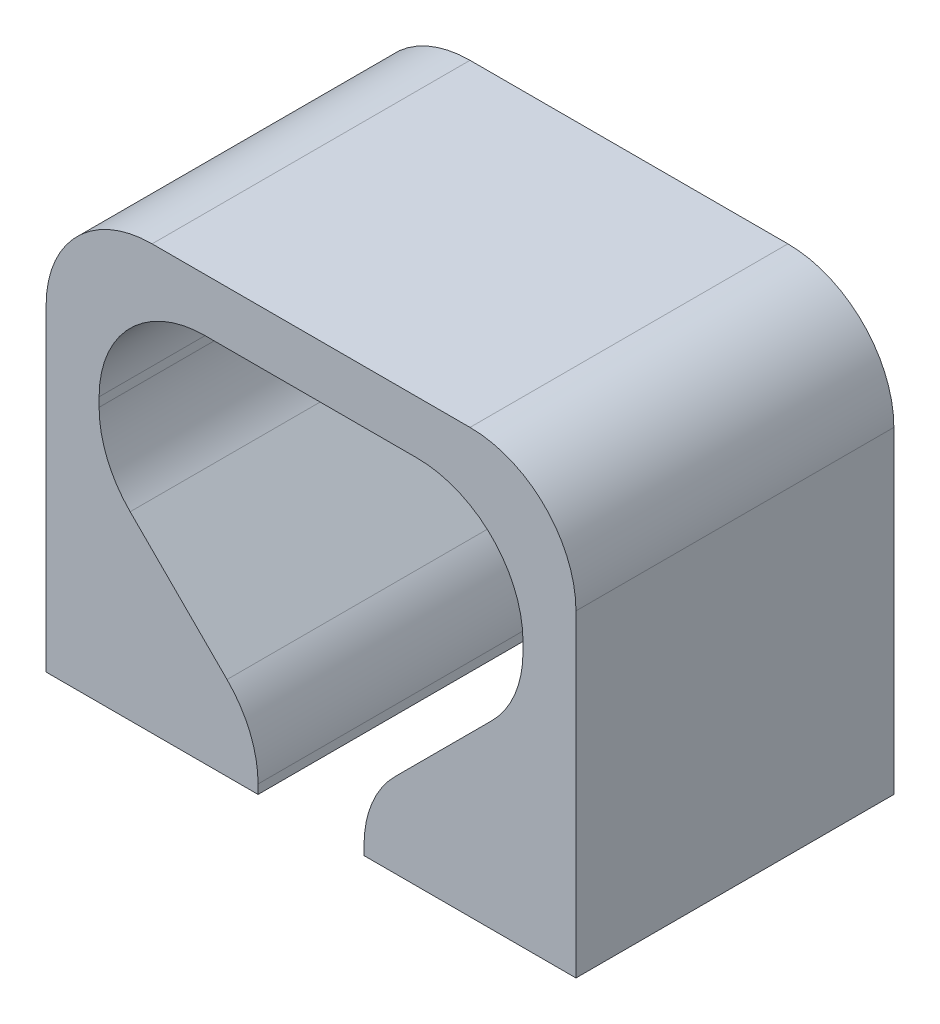
ISO-10303-21;
HEADER;
FILE_DESCRIPTION(('STEP AP214'),'2;1');
FILE_NAME('part.step','',(''),(''),'','','');
FILE_SCHEMA(('AUTOMOTIVE_DESIGN { 1 0 10303 214 1 1 1 1 }'));
ENDSEC;
DATA;
#1=APPLICATION_CONTEXT('core data for automotive mechanical design processes');
#2=APPLICATION_PROTOCOL_DEFINITION('international standard','automotive_design',2000,#1);
#3=PRODUCT_CONTEXT('',#1,'mechanical');
#4=PRODUCT('Part','Part','',(#3));
#5=PRODUCT_RELATED_PRODUCT_CATEGORY('part','',(#4));
#6=PRODUCT_DEFINITION_FORMATION('','',#4);
#7=PRODUCT_DEFINITION_CONTEXT('part definition',#1,'design');
#8=PRODUCT_DEFINITION('design','',#6,#7);
#9=PRODUCT_DEFINITION_SHAPE('','',#8);
#10=(LENGTH_UNIT() NAMED_UNIT(*) SI_UNIT(.MILLI.,.METRE.));
#11=(NAMED_UNIT(*) PLANE_ANGLE_UNIT() SI_UNIT($,.RADIAN.));
#12=(NAMED_UNIT(*) SI_UNIT($,.STERADIAN.) SOLID_ANGLE_UNIT());
#13=UNCERTAINTY_MEASURE_WITH_UNIT(LENGTH_MEASURE(1.E-05),#10,'distance_accuracy_value','');
#14=(GEOMETRIC_REPRESENTATION_CONTEXT(3) GLOBAL_UNCERTAINTY_ASSIGNED_CONTEXT((#13)) GLOBAL_UNIT_ASSIGNED_CONTEXT((#10,
#11,#12)) REPRESENTATION_CONTEXT('',''));
#15=CARTESIAN_POINT('',(0.,0.,0.));
#16=DIRECTION('',(0.,0.,1.));
#17=DIRECTION('',(1.,0.,0.));
#18=AXIS2_PLACEMENT_3D('',#15,#16,#17);
#19=CARTESIAN_POINT('',(-12.5,0.,-7.5));
#20=DIRECTION('',(-1.,0.,0.));
#21=DIRECTION('',(0.,-1.,0.));
#22=AXIS2_PLACEMENT_3D('',#19,#20,#21);
#23=PLANE('',#22);
#24=DIRECTION('',(0.,-1.,0.));
#25=VECTOR('',#24,1.);
#26=CARTESIAN_POINT('',(-12.5,0.,7.5));
#27=LINE('',#26,#25);
#28=CARTESIAN_POINT('',(-12.5,15.,7.5));
#29=VERTEX_POINT('',#28);
#30=CARTESIAN_POINT('',(-12.5,0.,7.5));
#31=VERTEX_POINT('',#30);
#32=EDGE_CURVE('E173',#29,#31,#27,.T.);
#33=ORIENTED_EDGE('',*,*,#32,.F.);
#34=DIRECTION('',(0.,0.,1.));
#35=VECTOR('',#34,1.);
#36=CARTESIAN_POINT('',(-12.5,15.,-7.5));
#37=LINE('',#36,#35);
#38=CARTESIAN_POINT('',(-12.5,15.,-7.5));
#39=VERTEX_POINT('',#38);
#40=EDGE_CURVE('E307',#29,#39,#37,.F.);
#41=ORIENTED_EDGE('',*,*,#40,.T.);
#42=DIRECTION('',(0.,-1.,0.));
#43=VECTOR('',#42,1.);
#44=CARTESIAN_POINT('',(-12.5,0.,-7.5));
#45=LINE('',#44,#43);
#46=CARTESIAN_POINT('',(-12.5,0.,-7.5));
#47=VERTEX_POINT('',#46);
#48=EDGE_CURVE('E189',#39,#47,#45,.T.);
#49=ORIENTED_EDGE('',*,*,#48,.T.);
#50=DIRECTION('',(0.,0.,1.));
#51=VECTOR('',#50,1.);
#52=CARTESIAN_POINT('',(-12.5,0.,-7.5));
#53=LINE('',#52,#51);
#54=EDGE_CURVE('E187',#47,#31,#53,.T.);
#55=ORIENTED_EDGE('',*,*,#54,.T.);
#56=EDGE_LOOP('',(#33,#41,#49,#55));
#57=FACE_BOUND('',#56,.T.);
#58=ADVANCED_FACE('F35',(#57),#23,.T.);
#59=CARTESIAN_POINT('',(-12.5,20.,-7.5));
#60=DIRECTION('',(0.,1.,0.));
#61=DIRECTION('',(-1.,0.,0.));
#62=AXIS2_PLACEMENT_3D('',#59,#60,#61);
#63=PLANE('',#62);
#64=DIRECTION('',(-1.,0.,0.));
#65=VECTOR('',#64,1.);
#66=CARTESIAN_POINT('',(-12.5,20.,7.5));
#67=LINE('',#66,#65);
#68=CARTESIAN_POINT('',(7.5,20.,7.5));
#69=VERTEX_POINT('',#68);
#70=CARTESIAN_POINT('',(-7.5,20.,7.5));
#71=VERTEX_POINT('',#70);
#72=EDGE_CURVE('E223',#69,#71,#67,.T.);
#73=ORIENTED_EDGE('',*,*,#72,.F.);
#74=DIRECTION('',(0.,0.,1.));
#75=VECTOR('',#74,1.);
#76=CARTESIAN_POINT('',(7.5,20.,-7.5));
#77=LINE('',#76,#75);
#78=CARTESIAN_POINT('',(7.5,20.,-7.5));
#79=VERTEX_POINT('',#78);
#80=EDGE_CURVE('E305',#69,#79,#77,.F.);
#81=ORIENTED_EDGE('',*,*,#80,.T.);
#82=DIRECTION('',(-1.,0.,0.));
#83=VECTOR('',#82,1.);
#84=CARTESIAN_POINT('',(-12.5,20.,-7.5));
#85=LINE('',#84,#83);
#86=CARTESIAN_POINT('',(-7.5,20.,-7.5));
#87=VERTEX_POINT('',#86);
#88=EDGE_CURVE('E194',#79,#87,#85,.T.);
#89=ORIENTED_EDGE('',*,*,#88,.T.);
#90=DIRECTION('',(0.,0.,1.));
#91=VECTOR('',#90,1.);
#92=CARTESIAN_POINT('',(-7.5,20.,-7.5));
#93=LINE('',#92,#91);
#94=EDGE_CURVE('E302',#87,#71,#93,.T.);
#95=ORIENTED_EDGE('',*,*,#94,.T.);
#96=EDGE_LOOP('',(#73,#81,#89,#95));
#97=FACE_BOUND('',#96,.T.);
#98=ADVANCED_FACE('F358',(#97),#63,.T.);
#99=CARTESIAN_POINT('',(12.5,20.,-7.5));
#100=DIRECTION('',(1.,0.,0.));
#101=DIRECTION('',(0.,1.,0.));
#102=AXIS2_PLACEMENT_3D('',#99,#100,#101);
#103=PLANE('',#102);
#104=DIRECTION('',(0.,1.,0.));
#105=VECTOR('',#104,1.);
#106=CARTESIAN_POINT('',(12.5,20.,-7.5));
#107=LINE('',#106,#105);
#108=CARTESIAN_POINT('',(12.5,0.,-7.5));
#109=VERTEX_POINT('',#108);
#110=CARTESIAN_POINT('',(12.5,15.,-7.5));
#111=VERTEX_POINT('',#110);
#112=EDGE_CURVE('E249',#109,#111,#107,.T.);
#113=ORIENTED_EDGE('',*,*,#112,.T.);
#114=DIRECTION('',(0.,0.,1.));
#115=VECTOR('',#114,1.);
#116=CARTESIAN_POINT('',(12.5,15.,-7.5));
#117=LINE('',#116,#115);
#118=CARTESIAN_POINT('',(12.5,15.,7.5));
#119=VERTEX_POINT('',#118);
#120=EDGE_CURVE('E299',#111,#119,#117,.T.);
#121=ORIENTED_EDGE('',*,*,#120,.T.);
#122=DIRECTION('',(0.,1.,0.));
#123=VECTOR('',#122,1.);
#124=CARTESIAN_POINT('',(12.5,20.,7.5));
#125=LINE('',#124,#123);
#126=CARTESIAN_POINT('',(12.5,0.,7.5));
#127=VERTEX_POINT('',#126);
#128=EDGE_CURVE('E220',#127,#119,#125,.T.);
#129=ORIENTED_EDGE('',*,*,#128,.F.);
#130=DIRECTION('',(0.,0.,1.));
#131=VECTOR('',#130,1.);
#132=CARTESIAN_POINT('',(12.5,0.,-7.5));
#133=LINE('',#132,#131);
#134=EDGE_CURVE('E254',#109,#127,#133,.T.);
#135=ORIENTED_EDGE('',*,*,#134,.F.);
#136=EDGE_LOOP('',(#113,#121,#129,#135));
#137=FACE_BOUND('',#136,.T.);
#138=ADVANCED_FACE('F366',(#137),#103,.T.);
#139=CARTESIAN_POINT('',(12.5,0.,-7.5));
#140=DIRECTION('',(0.,-1.,0.));
#141=DIRECTION('',(1.,0.,0.));
#142=AXIS2_PLACEMENT_3D('',#139,#140,#141);
#143=PLANE('',#142);
#144=ORIENTED_EDGE('',*,*,#134,.T.);
#145=DIRECTION('',(1.,0.,0.));
#146=VECTOR('',#145,1.);
#147=CARTESIAN_POINT('',(12.5,0.,7.5));
#148=LINE('',#147,#146);
#149=CARTESIAN_POINT('',(2.5,0.,7.5));
#150=VERTEX_POINT('',#149);
#151=EDGE_CURVE('E217',#150,#127,#148,.T.);
#152=ORIENTED_EDGE('',*,*,#151,.F.);
#153=DIRECTION('',(0.,0.,1.));
#154=VECTOR('',#153,1.);
#155=CARTESIAN_POINT('',(2.5,0.,-7.5));
#156=LINE('',#155,#154);
#157=CARTESIAN_POINT('',(2.5,0.,-7.5));
#158=VERTEX_POINT('',#157);
#159=EDGE_CURVE('E257',#158,#150,#156,.T.);
#160=ORIENTED_EDGE('',*,*,#159,.F.);
#161=DIRECTION('',(1.,0.,0.));
#162=VECTOR('',#161,1.);
#163=CARTESIAN_POINT('',(12.5,0.,-7.5));
#164=LINE('',#163,#162);
#165=EDGE_CURVE('E246',#158,#109,#164,.T.);
#166=ORIENTED_EDGE('',*,*,#165,.T.);
#167=EDGE_LOOP('',(#144,#152,#160,#166));
#168=FACE_BOUND('',#167,.T.);
#169=ADVANCED_FACE('F371',(#168),#143,.T.);
#170=CARTESIAN_POINT('',(2.5,0.,-7.5));
#171=DIRECTION('',(-1.,0.,0.));
#172=DIRECTION('',(0.,0.,1.));
#173=AXIS2_PLACEMENT_3D('',#170,#171,#172);
#174=PLANE('',#173);
#175=DIRECTION('',(0.,-1.,0.));
#176=VECTOR('',#175,1.);
#177=CARTESIAN_POINT('',(2.5,0.,7.5));
#178=LINE('',#177,#176);
#179=CARTESIAN_POINT('',(2.5,0.428932188134523,7.5));
#180=VERTEX_POINT('',#179);
#181=EDGE_CURVE('E215',#180,#150,#178,.T.);
#182=ORIENTED_EDGE('',*,*,#181,.F.);
#183=DIRECTION('',(0.,0.,1.));
#184=VECTOR('',#183,1.);
#185=CARTESIAN_POINT('',(2.5,0.428932188134523,-7.5));
#186=LINE('',#185,#184);
#187=CARTESIAN_POINT('',(2.5,0.428932188134523,-7.5));
#188=VERTEX_POINT('',#187);
#189=EDGE_CURVE('E277',#180,#188,#186,.F.);
#190=ORIENTED_EDGE('',*,*,#189,.T.);
#191=DIRECTION('',(0.,-1.,0.));
#192=VECTOR('',#191,1.);
#193=CARTESIAN_POINT('',(2.5,0.,-7.5));
#194=LINE('',#193,#192);
#195=EDGE_CURVE('E244',#188,#158,#194,.T.);
#196=ORIENTED_EDGE('',*,*,#195,.T.);
#197=ORIENTED_EDGE('',*,*,#159,.T.);
#198=EDGE_LOOP('',(#182,#190,#196,#197));
#199=FACE_BOUND('',#198,.T.);
#200=ADVANCED_FACE('F375',(#199),#174,.T.);
#201=CARTESIAN_POINT('',(2.5,2.5,-7.5));
#202=DIRECTION('',(-0.707106781186547,0.707106781186548,0.));
#203=DIRECTION('',(-0.707106781186548,-0.707106781186547,0.));
#204=AXIS2_PLACEMENT_3D('',#201,#202,#203);
#205=PLANE('',#204);
#206=DIRECTION('',(-0.707106781186548,-0.707106781186547,0.));
#207=VECTOR('',#206,1.);
#208=CARTESIAN_POINT('',(2.5,2.5,7.5));
#209=LINE('',#208,#207);
#210=CARTESIAN_POINT('',(8.53553390593274,8.53553390593273,7.5));
#211=VERTEX_POINT('',#210);
#212=CARTESIAN_POINT('',(3.96446609406726,3.96446609406726,7.5));
#213=VERTEX_POINT('',#212);
#214=EDGE_CURVE('E213',#211,#213,#209,.T.);
#215=ORIENTED_EDGE('',*,*,#214,.F.);
#216=DIRECTION('',(0.,0.,1.));
#217=VECTOR('',#216,1.);
#218=CARTESIAN_POINT('',(8.53553390593274,8.53553390593273,-7.5));
#219=LINE('',#218,#217);
#220=CARTESIAN_POINT('',(8.53553390593274,8.53553390593273,-7.5));
#221=VERTEX_POINT('',#220);
#222=EDGE_CURVE('E268',#211,#221,#219,.F.);
#223=ORIENTED_EDGE('',*,*,#222,.T.);
#224=DIRECTION('',(-0.707106781186548,-0.707106781186547,0.));
#225=VECTOR('',#224,1.);
#226=CARTESIAN_POINT('',(2.5,2.5,-7.5));
#227=LINE('',#226,#225);
#228=CARTESIAN_POINT('',(3.96446609406726,3.96446609406726,-7.5));
#229=VERTEX_POINT('',#228);
#230=EDGE_CURVE('E241',#221,#229,#227,.T.);
#231=ORIENTED_EDGE('',*,*,#230,.T.);
#232=DIRECTION('',(0.,0.,1.));
#233=VECTOR('',#232,1.);
#234=CARTESIAN_POINT('',(3.96446609406726,3.96446609406726,-7.5));
#235=LINE('',#234,#233);
#236=EDGE_CURVE('E265',#229,#213,#235,.T.);
#237=ORIENTED_EDGE('',*,*,#236,.T.);
#238=EDGE_LOOP('',(#215,#223,#231,#237));
#239=FACE_BOUND('',#238,.T.);
#240=ADVANCED_FACE('F384',(#239),#205,.T.);
#241=CARTESIAN_POINT('',(10.,10.,-7.5));
#242=DIRECTION('',(-1.,0.,0.));
#243=DIRECTION('',(0.,-1.,0.));
#244=AXIS2_PLACEMENT_3D('',#241,#242,#243);
#245=PLANE('',#244);
#246=DIRECTION('',(0.,-1.,0.));
#247=VECTOR('',#246,1.);
#248=CARTESIAN_POINT('',(10.,10.,-7.5));
#249=LINE('',#248,#247);
#250=CARTESIAN_POINT('',(10.,12.5,-7.5));
#251=VERTEX_POINT('',#250);
#252=CARTESIAN_POINT('',(10.,12.0710678118655,-7.5));
#253=VERTEX_POINT('',#252);
#254=EDGE_CURVE('E238',#251,#253,#249,.T.);
#255=ORIENTED_EDGE('',*,*,#254,.T.);
#256=DIRECTION('',(0.,0.,1.));
#257=VECTOR('',#256,1.);
#258=CARTESIAN_POINT('',(10.,12.0710678118655,7.5));
#259=LINE('',#258,#257);
#260=CARTESIAN_POINT('',(10.,12.0710678118655,7.5));
#261=VERTEX_POINT('',#260);
#262=EDGE_CURVE('E262',#253,#261,#259,.T.);
#263=ORIENTED_EDGE('',*,*,#262,.T.);
#264=DIRECTION('',(0.,-1.,0.));
#265=VECTOR('',#264,1.);
#266=CARTESIAN_POINT('',(10.,10.,7.5));
#267=LINE('',#266,#265);
#268=CARTESIAN_POINT('',(10.,12.5,7.5));
#269=VERTEX_POINT('',#268);
#270=EDGE_CURVE('E210',#269,#261,#267,.T.);
#271=ORIENTED_EDGE('',*,*,#270,.F.);
#272=DIRECTION('',(0.,0.,1.));
#273=VECTOR('',#272,1.);
#274=CARTESIAN_POINT('',(10.,12.5,-7.5));
#275=LINE('',#274,#273);
#276=EDGE_CURVE('E256',#269,#251,#275,.F.);
#277=ORIENTED_EDGE('',*,*,#276,.T.);
#278=EDGE_LOOP('',(#255,#263,#271,#277));
#279=FACE_BOUND('',#278,.T.);
#280=ADVANCED_FACE('F392',(#279),#245,.T.);
#281=CARTESIAN_POINT('',(10.,17.5,-7.5));
#282=DIRECTION('',(0.,-1.,0.));
#283=DIRECTION('',(1.,0.,0.));
#284=AXIS2_PLACEMENT_3D('',#281,#282,#283);
#285=PLANE('',#284);
#286=DIRECTION('',(1.,0.,0.));
#287=VECTOR('',#286,1.);
#288=CARTESIAN_POINT('',(10.,17.5,-7.5));
#289=LINE('',#288,#287);
#290=CARTESIAN_POINT('',(-5.,17.5,-7.5));
#291=VERTEX_POINT('',#290);
#292=CARTESIAN_POINT('',(5.,17.5,-7.5));
#293=VERTEX_POINT('',#292);
#294=EDGE_CURVE('E235',#291,#293,#289,.T.);
#295=ORIENTED_EDGE('',*,*,#294,.T.);
#296=DIRECTION('',(0.,0.,1.));
#297=VECTOR('',#296,1.);
#298=CARTESIAN_POINT('',(5.,17.5,7.5));
#299=LINE('',#298,#297);
#300=CARTESIAN_POINT('',(5.,17.5,7.5));
#301=VERTEX_POINT('',#300);
#302=EDGE_CURVE('E311',#293,#301,#299,.T.);
#303=ORIENTED_EDGE('',*,*,#302,.T.);
#304=DIRECTION('',(1.,0.,0.));
#305=VECTOR('',#304,1.);
#306=CARTESIAN_POINT('',(10.,17.5,7.5));
#307=LINE('',#306,#305);
#308=CARTESIAN_POINT('',(-5.,17.5,7.5));
#309=VERTEX_POINT('',#308);
#310=EDGE_CURVE('E207',#309,#301,#307,.T.);
#311=ORIENTED_EDGE('',*,*,#310,.F.);
#312=DIRECTION('',(0.,0.,1.));
#313=VECTOR('',#312,1.);
#314=CARTESIAN_POINT('',(-5.,17.5,-7.5));
#315=LINE('',#314,#313);
#316=EDGE_CURVE('E309',#309,#291,#315,.F.);
#317=ORIENTED_EDGE('',*,*,#316,.T.);
#318=EDGE_LOOP('',(#295,#303,#311,#317));
#319=FACE_BOUND('',#318,.T.);
#320=ADVANCED_FACE('F330',(#319),#285,.T.);
#321=CARTESIAN_POINT('',(-10.,17.5,-7.5));
#322=DIRECTION('',(1.,0.,0.));
#323=DIRECTION('',(0.,0.,-1.));
#324=AXIS2_PLACEMENT_3D('',#321,#322,#323);
#325=PLANE('',#324);
#326=DIRECTION('',(0.,1.,0.));
#327=VECTOR('',#326,1.);
#328=CARTESIAN_POINT('',(-10.,17.5,7.5));
#329=LINE('',#328,#327);
#330=CARTESIAN_POINT('',(-10.,12.0710678118655,7.5));
#331=VERTEX_POINT('',#330);
#332=CARTESIAN_POINT('',(-10.,12.5,7.5));
#333=VERTEX_POINT('',#332);
#334=EDGE_CURVE('E204',#331,#333,#329,.T.);
#335=ORIENTED_EDGE('',*,*,#334,.F.);
#336=DIRECTION('',(0.,0.,1.));
#337=VECTOR('',#336,1.);
#338=CARTESIAN_POINT('',(-10.,12.0710678118655,-7.5));
#339=LINE('',#338,#337);
#340=CARTESIAN_POINT('',(-10.,12.0710678118655,-7.5));
#341=VERTEX_POINT('',#340);
#342=EDGE_CURVE('E297',#331,#341,#339,.F.);
#343=ORIENTED_EDGE('',*,*,#342,.T.);
#344=DIRECTION('',(0.,1.,0.));
#345=VECTOR('',#344,1.);
#346=CARTESIAN_POINT('',(-10.,17.5,-7.5));
#347=LINE('',#346,#345);
#348=CARTESIAN_POINT('',(-10.,12.5,-7.5));
#349=VERTEX_POINT('',#348);
#350=EDGE_CURVE('E232',#341,#349,#347,.T.);
#351=ORIENTED_EDGE('',*,*,#350,.T.);
#352=DIRECTION('',(0.,0.,1.));
#353=VECTOR('',#352,1.);
#354=CARTESIAN_POINT('',(-10.,12.5,7.5));
#355=LINE('',#354,#353);
#356=EDGE_CURVE('E294',#349,#333,#355,.T.);
#357=ORIENTED_EDGE('',*,*,#356,.T.);
#358=EDGE_LOOP('',(#335,#343,#351,#357));
#359=FACE_BOUND('',#358,.T.);
#360=ADVANCED_FACE('F337',(#359),#325,.T.);
#361=CARTESIAN_POINT('',(-10.,9.99999999999999,-7.5));
#362=DIRECTION('',(0.707106781186547,0.707106781186548,0.));
#363=DIRECTION('',(-0.707106781186548,0.707106781186547,0.));
#364=AXIS2_PLACEMENT_3D('',#361,#362,#363);
#365=PLANE('',#364);
#366=DIRECTION('',(-0.707106781186548,0.707106781186547,0.));
#367=VECTOR('',#366,1.);
#368=CARTESIAN_POINT('',(-10.,9.99999999999999,7.5));
#369=LINE('',#368,#367);
#370=CARTESIAN_POINT('',(-3.96446609406726,3.96446609406726,7.5));
#371=VERTEX_POINT('',#370);
#372=CARTESIAN_POINT('',(-8.53553390593274,8.53553390593273,7.5));
#373=VERTEX_POINT('',#372);
#374=EDGE_CURVE('E199',#371,#373,#369,.T.);
#375=ORIENTED_EDGE('',*,*,#374,.F.);
#376=DIRECTION('',(0.,0.,1.));
#377=VECTOR('',#376,1.);
#378=CARTESIAN_POINT('',(-3.96446609406726,3.96446609406726,-7.5));
#379=LINE('',#378,#377);
#380=CARTESIAN_POINT('',(-3.96446609406726,3.96446609406726,-7.5));
#381=VERTEX_POINT('',#380);
#382=EDGE_CURVE('E292',#371,#381,#379,.F.);
#383=ORIENTED_EDGE('',*,*,#382,.T.);
#384=DIRECTION('',(-0.707106781186548,0.707106781186547,0.));
#385=VECTOR('',#384,1.);
#386=CARTESIAN_POINT('',(-10.,9.99999999999999,-7.5));
#387=LINE('',#386,#385);
#388=CARTESIAN_POINT('',(-8.53553390593274,8.53553390593273,-7.5));
#389=VERTEX_POINT('',#388);
#390=EDGE_CURVE('E230',#381,#389,#387,.T.);
#391=ORIENTED_EDGE('',*,*,#390,.T.);
#392=DIRECTION('',(0.,0.,1.));
#393=VECTOR('',#392,1.);
#394=CARTESIAN_POINT('',(-8.53553390593274,8.53553390593273,7.5));
#395=LINE('',#394,#393);
#396=EDGE_CURVE('E289',#389,#373,#395,.T.);
#397=ORIENTED_EDGE('',*,*,#396,.T.);
#398=EDGE_LOOP('',(#375,#383,#391,#397));
#399=FACE_BOUND('',#398,.T.);
#400=ADVANCED_FACE('F344',(#399),#365,.T.);
#401=CARTESIAN_POINT('',(-2.5,2.5,-7.5));
#402=DIRECTION('',(1.,0.,0.));
#403=DIRECTION('',(0.,0.,-1.));
#404=AXIS2_PLACEMENT_3D('',#401,#402,#403);
#405=PLANE('',#404);
#406=DIRECTION('',(0.,1.,0.));
#407=VECTOR('',#406,1.);
#408=CARTESIAN_POINT('',(-2.5,2.5,-7.5));
#409=LINE('',#408,#407);
#410=CARTESIAN_POINT('',(-2.5,0.,-7.5));
#411=VERTEX_POINT('',#410);
#412=CARTESIAN_POINT('',(-2.5,0.428932188134524,-7.5));
#413=VERTEX_POINT('',#412);
#414=EDGE_CURVE('E228',#411,#413,#409,.T.);
#415=ORIENTED_EDGE('',*,*,#414,.T.);
#416=DIRECTION('',(0.,0.,1.));
#417=VECTOR('',#416,1.);
#418=CARTESIAN_POINT('',(-2.5,0.428932188134524,-7.5));
#419=LINE('',#418,#417);
#420=CARTESIAN_POINT('',(-2.5,0.428932188134524,7.5));
#421=VERTEX_POINT('',#420);
#422=EDGE_CURVE('E286',#413,#421,#419,.T.);
#423=ORIENTED_EDGE('',*,*,#422,.T.);
#424=DIRECTION('',(0.,1.,0.));
#425=VECTOR('',#424,1.);
#426=CARTESIAN_POINT('',(-2.5,2.5,7.5));
#427=LINE('',#426,#425);
#428=CARTESIAN_POINT('',(-2.5,0.,7.5));
#429=VERTEX_POINT('',#428);
#430=EDGE_CURVE('E197',#429,#421,#427,.T.);
#431=ORIENTED_EDGE('',*,*,#430,.F.);
#432=DIRECTION('',(0.,0.,1.));
#433=VECTOR('',#432,1.);
#434=CARTESIAN_POINT('',(-2.5,0.,-7.5));
#435=LINE('',#434,#433);
#436=EDGE_CURVE('E193',#411,#429,#435,.T.);
#437=ORIENTED_EDGE('',*,*,#436,.F.);
#438=EDGE_LOOP('',(#415,#423,#431,#437));
#439=FACE_BOUND('',#438,.T.);
#440=ADVANCED_FACE('F350',(#439),#405,.T.);
#441=CARTESIAN_POINT('',(-2.5,0.,-7.5));
#442=DIRECTION('',(0.,-1.,0.));
#443=DIRECTION('',(1.,0.,0.));
#444=AXIS2_PLACEMENT_3D('',#441,#442,#443);
#445=PLANE('',#444);
#446=ORIENTED_EDGE('',*,*,#436,.T.);
#447=DIRECTION('',(1.,0.,0.));
#448=VECTOR('',#447,1.);
#449=CARTESIAN_POINT('',(-2.5,0.,7.5));
#450=LINE('',#449,#448);
#451=EDGE_CURVE('E179',#31,#429,#450,.T.);
#452=ORIENTED_EDGE('',*,*,#451,.F.);
#453=ORIENTED_EDGE('',*,*,#54,.F.);
#454=DIRECTION('',(1.,0.,0.));
#455=VECTOR('',#454,1.);
#456=CARTESIAN_POINT('',(-2.5,0.,-7.5));
#457=LINE('',#456,#455);
#458=EDGE_CURVE('E226',#47,#411,#457,.T.);
#459=ORIENTED_EDGE('',*,*,#458,.T.);
#460=EDGE_LOOP('',(#446,#452,#453,#459));
#461=FACE_BOUND('',#460,.T.);
#462=ADVANCED_FACE('F196',(#461),#445,.T.);
#463=CARTESIAN_POINT('',(0.,0.,-7.5));
#464=DIRECTION('',(0.,0.,-1.));
#465=DIRECTION('',(-1.,0.,0.));
#466=AXIS2_PLACEMENT_3D('',#463,#464,#465);
#467=PLANE('',#466);
#468=ORIENTED_EDGE('',*,*,#195,.F.);
#469=CARTESIAN_POINT('',(7.5,0.428932188134523,-7.5));
#470=DIRECTION('',(0.,0.,-1.));
#471=DIRECTION('',(-1.,0.,0.));
#472=AXIS2_PLACEMENT_3D('',#469,#470,#471);
#473=CIRCLE('',#472,5.);
#474=EDGE_CURVE('E284',#188,#229,#473,.T.);
#475=ORIENTED_EDGE('',*,*,#474,.T.);
#476=ORIENTED_EDGE('',*,*,#230,.F.);
#477=CARTESIAN_POINT('',(5.00000000000001,12.0710678118655,-7.5));
#478=DIRECTION('',(0.,0.,-1.));
#479=DIRECTION('',(-1.,0.,0.));
#480=AXIS2_PLACEMENT_3D('',#477,#478,#479);
#481=CIRCLE('',#480,5.);
#482=EDGE_CURVE('E316',#221,#253,#481,.F.);
#483=ORIENTED_EDGE('',*,*,#482,.T.);
#484=ORIENTED_EDGE('',*,*,#254,.F.);
#485=CARTESIAN_POINT('',(5.00000000000001,12.5,-7.5));
#486=DIRECTION('',(0.,0.,-1.));
#487=DIRECTION('',(-1.,0.,0.));
#488=AXIS2_PLACEMENT_3D('',#485,#486,#487);
#489=CIRCLE('',#488,5.);
#490=EDGE_CURVE('E323',#251,#293,#489,.F.);
#491=ORIENTED_EDGE('',*,*,#490,.T.);
#492=ORIENTED_EDGE('',*,*,#294,.F.);
#493=CARTESIAN_POINT('',(-5.,12.5,-7.5));
#494=DIRECTION('',(0.,0.,-1.));
#495=DIRECTION('',(-1.,0.,0.));
#496=AXIS2_PLACEMENT_3D('',#493,#494,#495);
#497=CIRCLE('',#496,5.);
#498=EDGE_CURVE('E11',#291,#349,#497,.F.);
#499=ORIENTED_EDGE('',*,*,#498,.T.);
#500=ORIENTED_EDGE('',*,*,#350,.F.);
#501=CARTESIAN_POINT('',(-5.,12.0710678118655,-7.5));
#502=DIRECTION('',(0.,0.,-1.));
#503=DIRECTION('',(-1.,0.,0.));
#504=AXIS2_PLACEMENT_3D('',#501,#502,#503);
#505=CIRCLE('',#504,5.);
#506=EDGE_CURVE('E56',#341,#389,#505,.F.);
#507=ORIENTED_EDGE('',*,*,#506,.T.);
#508=ORIENTED_EDGE('',*,*,#390,.F.);
#509=CARTESIAN_POINT('',(-7.5,0.428932188134524,-7.5));
#510=DIRECTION('',(0.,0.,-1.));
#511=DIRECTION('',(-1.,0.,0.));
#512=AXIS2_PLACEMENT_3D('',#509,#510,#511);
#513=CIRCLE('',#512,5.);
#514=EDGE_CURVE('E50',#381,#413,#513,.T.);
#515=ORIENTED_EDGE('',*,*,#514,.T.);
#516=ORIENTED_EDGE('',*,*,#414,.F.);
#517=ORIENTED_EDGE('',*,*,#458,.F.);
#518=ORIENTED_EDGE('',*,*,#48,.F.);
#519=CARTESIAN_POINT('',(-7.5,15.,-7.5));
#520=DIRECTION('',(0.,0.,-1.));
#521=DIRECTION('',(-1.,0.,0.));
#522=AXIS2_PLACEMENT_3D('',#519,#520,#521);
#523=CIRCLE('',#522,5.);
#524=EDGE_CURVE('E279',#39,#87,#523,.T.);
#525=ORIENTED_EDGE('',*,*,#524,.T.);
#526=ORIENTED_EDGE('',*,*,#88,.F.);
#527=CARTESIAN_POINT('',(7.5,15.,-7.5));
#528=DIRECTION('',(0.,0.,-1.));
#529=DIRECTION('',(-1.,0.,0.));
#530=AXIS2_PLACEMENT_3D('',#527,#528,#529);
#531=CIRCLE('',#530,5.);
#532=EDGE_CURVE('E281',#79,#111,#531,.T.);
#533=ORIENTED_EDGE('',*,*,#532,.T.);
#534=ORIENTED_EDGE('',*,*,#112,.F.);
#535=ORIENTED_EDGE('',*,*,#165,.F.);
#536=EDGE_LOOP('',(#468,#475,#476,#483,#484,#491,#492,#499,#500,#507,#508,#515,#516,#517,#518,
#525,#526,#533,#534,#535));
#537=FACE_BOUND('',#536,.T.);
#538=ADVANCED_FACE('F335',(#537),#467,.T.);
#539=CARTESIAN_POINT('',(0.,0.,7.5));
#540=DIRECTION('',(0.,0.,-1.));
#541=DIRECTION('',(-1.,0.,0.));
#542=AXIS2_PLACEMENT_3D('',#539,#540,#541);
#543=PLANE('',#542);
#544=ORIENTED_EDGE('',*,*,#214,.T.);
#545=CARTESIAN_POINT('',(7.5,0.428932188134523,7.5));
#546=DIRECTION('',(0.,0.,-1.));
#547=DIRECTION('',(-1.,0.,0.));
#548=AXIS2_PLACEMENT_3D('',#545,#546,#547);
#549=CIRCLE('',#548,5.);
#550=EDGE_CURVE('E275',#213,#180,#549,.F.);
#551=ORIENTED_EDGE('',*,*,#550,.T.);
#552=ORIENTED_EDGE('',*,*,#181,.T.);
#553=ORIENTED_EDGE('',*,*,#151,.T.);
#554=ORIENTED_EDGE('',*,*,#128,.T.);
#555=CARTESIAN_POINT('',(7.5,15.,7.5));
#556=DIRECTION('',(0.,0.,-1.));
#557=DIRECTION('',(-1.,0.,0.));
#558=AXIS2_PLACEMENT_3D('',#555,#556,#557);
#559=CIRCLE('',#558,5.);
#560=EDGE_CURVE('E271',#119,#69,#559,.F.);
#561=ORIENTED_EDGE('',*,*,#560,.T.);
#562=ORIENTED_EDGE('',*,*,#72,.T.);
#563=CARTESIAN_POINT('',(-7.5,15.,7.5));
#564=DIRECTION('',(0.,0.,-1.));
#565=DIRECTION('',(-1.,0.,0.));
#566=AXIS2_PLACEMENT_3D('',#563,#564,#565);
#567=CIRCLE('',#566,5.);
#568=EDGE_CURVE('E182',#71,#29,#567,.F.);
#569=ORIENTED_EDGE('',*,*,#568,.T.);
#570=ORIENTED_EDGE('',*,*,#32,.T.);
#571=ORIENTED_EDGE('',*,*,#451,.T.);
#572=ORIENTED_EDGE('',*,*,#430,.T.);
#573=CARTESIAN_POINT('',(-7.5,0.428932188134524,7.5));
#574=DIRECTION('',(0.,0.,-1.));
#575=DIRECTION('',(-1.,0.,0.));
#576=AXIS2_PLACEMENT_3D('',#573,#574,#575);
#577=CIRCLE('',#576,5.);
#578=EDGE_CURVE('E273',#421,#371,#577,.F.);
#579=ORIENTED_EDGE('',*,*,#578,.T.);
#580=ORIENTED_EDGE('',*,*,#374,.T.);
#581=CARTESIAN_POINT('',(-5.,12.0710678118655,7.5));
#582=DIRECTION('',(0.,0.,-1.));
#583=DIRECTION('',(-1.,0.,0.));
#584=AXIS2_PLACEMENT_3D('',#581,#582,#583);
#585=CIRCLE('',#584,5.);
#586=EDGE_CURVE('E318',#373,#331,#585,.T.);
#587=ORIENTED_EDGE('',*,*,#586,.T.);
#588=ORIENTED_EDGE('',*,*,#334,.T.);
#589=CARTESIAN_POINT('',(-5.,12.5,7.5));
#590=DIRECTION('',(0.,0.,-1.));
#591=DIRECTION('',(-1.,0.,0.));
#592=AXIS2_PLACEMENT_3D('',#589,#590,#591);
#593=CIRCLE('',#592,5.);
#594=EDGE_CURVE('E43',#333,#309,#593,.T.);
#595=ORIENTED_EDGE('',*,*,#594,.T.);
#596=ORIENTED_EDGE('',*,*,#310,.T.);
#597=CARTESIAN_POINT('',(5.00000000000001,12.5,7.5));
#598=DIRECTION('',(0.,0.,-1.));
#599=DIRECTION('',(-1.,0.,0.));
#600=AXIS2_PLACEMENT_3D('',#597,#598,#599);
#601=CIRCLE('',#600,5.);
#602=EDGE_CURVE('E321',#301,#269,#601,.T.);
#603=ORIENTED_EDGE('',*,*,#602,.T.);
#604=ORIENTED_EDGE('',*,*,#270,.T.);
#605=CARTESIAN_POINT('',(5.00000000000001,12.0710678118655,7.5));
#606=DIRECTION('',(0.,0.,-1.));
#607=DIRECTION('',(-1.,0.,0.));
#608=AXIS2_PLACEMENT_3D('',#605,#606,#607);
#609=CIRCLE('',#608,5.);
#610=EDGE_CURVE('E314',#261,#211,#609,.T.);
#611=ORIENTED_EDGE('',*,*,#610,.T.);
#612=EDGE_LOOP('',(#544,#551,#552,#553,#554,#561,#562,#569,#570,#571,#572,#579,#580,#587,#588,
#595,#596,#603,#604,#611));
#613=FACE_BOUND('',#612,.T.);
#614=ADVANCED_FACE('F176',(#613),#543,.F.);
#615=CARTESIAN_POINT('',(5.00000000000001,12.0710678118655,-7.5));
#616=DIRECTION('',(0.,0.,-1.));
#617=DIRECTION('',(-1.,0.,0.));
#618=AXIS2_PLACEMENT_3D('',#615,#616,#617);
#619=CYLINDRICAL_SURFACE('',#618,5.);
#620=ORIENTED_EDGE('',*,*,#482,.F.);
#621=ORIENTED_EDGE('',*,*,#222,.F.);
#622=ORIENTED_EDGE('',*,*,#610,.F.);
#623=ORIENTED_EDGE('',*,*,#262,.F.);
#624=EDGE_LOOP('',(#620,#621,#622,#623));
#625=FACE_BOUND('',#624,.T.);
#626=ADVANCED_FACE('F390',(#625),#619,.F.);
#627=CARTESIAN_POINT('',(7.5,0.428932188134523,-7.5));
#628=DIRECTION('',(0.,0.,1.));
#629=DIRECTION('',(1.,0.,0.));
#630=AXIS2_PLACEMENT_3D('',#627,#628,#629);
#631=CYLINDRICAL_SURFACE('',#630,5.);
#632=ORIENTED_EDGE('',*,*,#474,.F.);
#633=ORIENTED_EDGE('',*,*,#189,.F.);
#634=ORIENTED_EDGE('',*,*,#550,.F.);
#635=ORIENTED_EDGE('',*,*,#236,.F.);
#636=EDGE_LOOP('',(#632,#633,#634,#635));
#637=FACE_BOUND('',#636,.T.);
#638=ADVANCED_FACE('F381',(#637),#631,.T.);
#639=CARTESIAN_POINT('',(-7.5,0.428932188134524,-7.5));
#640=DIRECTION('',(0.,0.,1.));
#641=DIRECTION('',(1.,0.,0.));
#642=AXIS2_PLACEMENT_3D('',#639,#640,#641);
#643=CYLINDRICAL_SURFACE('',#642,5.);
#644=ORIENTED_EDGE('',*,*,#514,.F.);
#645=ORIENTED_EDGE('',*,*,#382,.F.);
#646=ORIENTED_EDGE('',*,*,#578,.F.);
#647=ORIENTED_EDGE('',*,*,#422,.F.);
#648=EDGE_LOOP('',(#644,#645,#646,#647));
#649=FACE_BOUND('',#648,.T.);
#650=ADVANCED_FACE('F348',(#649),#643,.T.);
#651=CARTESIAN_POINT('',(-5.,12.0710678118655,-7.5));
#652=DIRECTION('',(0.,0.,-1.));
#653=DIRECTION('',(-1.,0.,0.));
#654=AXIS2_PLACEMENT_3D('',#651,#652,#653);
#655=CYLINDRICAL_SURFACE('',#654,5.);
#656=ORIENTED_EDGE('',*,*,#506,.F.);
#657=ORIENTED_EDGE('',*,*,#342,.F.);
#658=ORIENTED_EDGE('',*,*,#586,.F.);
#659=ORIENTED_EDGE('',*,*,#396,.F.);
#660=EDGE_LOOP('',(#656,#657,#658,#659));
#661=FACE_BOUND('',#660,.T.);
#662=ADVANCED_FACE('F340',(#661),#655,.F.);
#663=CARTESIAN_POINT('',(7.5,15.,-7.5));
#664=DIRECTION('',(0.,0.,1.));
#665=DIRECTION('',(1.,0.,0.));
#666=AXIS2_PLACEMENT_3D('',#663,#664,#665);
#667=CYLINDRICAL_SURFACE('',#666,5.);
#668=ORIENTED_EDGE('',*,*,#532,.F.);
#669=ORIENTED_EDGE('',*,*,#80,.F.);
#670=ORIENTED_EDGE('',*,*,#560,.F.);
#671=ORIENTED_EDGE('',*,*,#120,.F.);
#672=EDGE_LOOP('',(#668,#669,#670,#671));
#673=FACE_BOUND('',#672,.T.);
#674=ADVANCED_FACE('F364',(#673),#667,.T.);
#675=CARTESIAN_POINT('',(-7.5,15.,-7.5));
#676=DIRECTION('',(0.,0.,1.));
#677=DIRECTION('',(1.,0.,0.));
#678=AXIS2_PLACEMENT_3D('',#675,#676,#677);
#679=CYLINDRICAL_SURFACE('',#678,5.);
#680=ORIENTED_EDGE('',*,*,#524,.F.);
#681=ORIENTED_EDGE('',*,*,#40,.F.);
#682=ORIENTED_EDGE('',*,*,#568,.F.);
#683=ORIENTED_EDGE('',*,*,#94,.F.);
#684=EDGE_LOOP('',(#680,#681,#682,#683));
#685=FACE_BOUND('',#684,.T.);
#686=ADVANCED_FACE('F355',(#685),#679,.T.);
#687=CARTESIAN_POINT('',(5.00000000000001,12.5,-7.5));
#688=DIRECTION('',(0.,0.,-1.));
#689=DIRECTION('',(-1.,0.,0.));
#690=AXIS2_PLACEMENT_3D('',#687,#688,#689);
#691=CYLINDRICAL_SURFACE('',#690,5.);
#692=ORIENTED_EDGE('',*,*,#490,.F.);
#693=ORIENTED_EDGE('',*,*,#276,.F.);
#694=ORIENTED_EDGE('',*,*,#602,.F.);
#695=ORIENTED_EDGE('',*,*,#302,.F.);
#696=EDGE_LOOP('',(#692,#693,#694,#695));
#697=FACE_BOUND('',#696,.T.);
#698=ADVANCED_FACE('F397',(#697),#691,.F.);
#699=CARTESIAN_POINT('',(-5.,12.5,-7.5));
#700=DIRECTION('',(0.,0.,-1.));
#701=DIRECTION('',(-1.,0.,0.));
#702=AXIS2_PLACEMENT_3D('',#699,#700,#701);
#703=CYLINDRICAL_SURFACE('',#702,5.);
#704=ORIENTED_EDGE('',*,*,#498,.F.);
#705=ORIENTED_EDGE('',*,*,#316,.F.);
#706=ORIENTED_EDGE('',*,*,#594,.F.);
#707=ORIENTED_EDGE('',*,*,#356,.F.);
#708=EDGE_LOOP('',(#704,#705,#706,#707));
#709=FACE_BOUND('',#708,.T.);
#710=ADVANCED_FACE('F37',(#709),#703,.F.);
#711=CLOSED_SHELL('',(#58,#98,#138,#169,#200,#240,#280,#320,#360,#400,#440,#462,#538,#614,#626,
#638,#650,#662,#674,#686,#698,#710));
#712=MANIFOLD_SOLID_BREP('B2',#711);
#713=ADVANCED_BREP_SHAPE_REPRESENTATION('',(#18,#712),#14);
#714=SHAPE_DEFINITION_REPRESENTATION(#9,#713);
ENDSEC;
END-ISO-10303-21;
